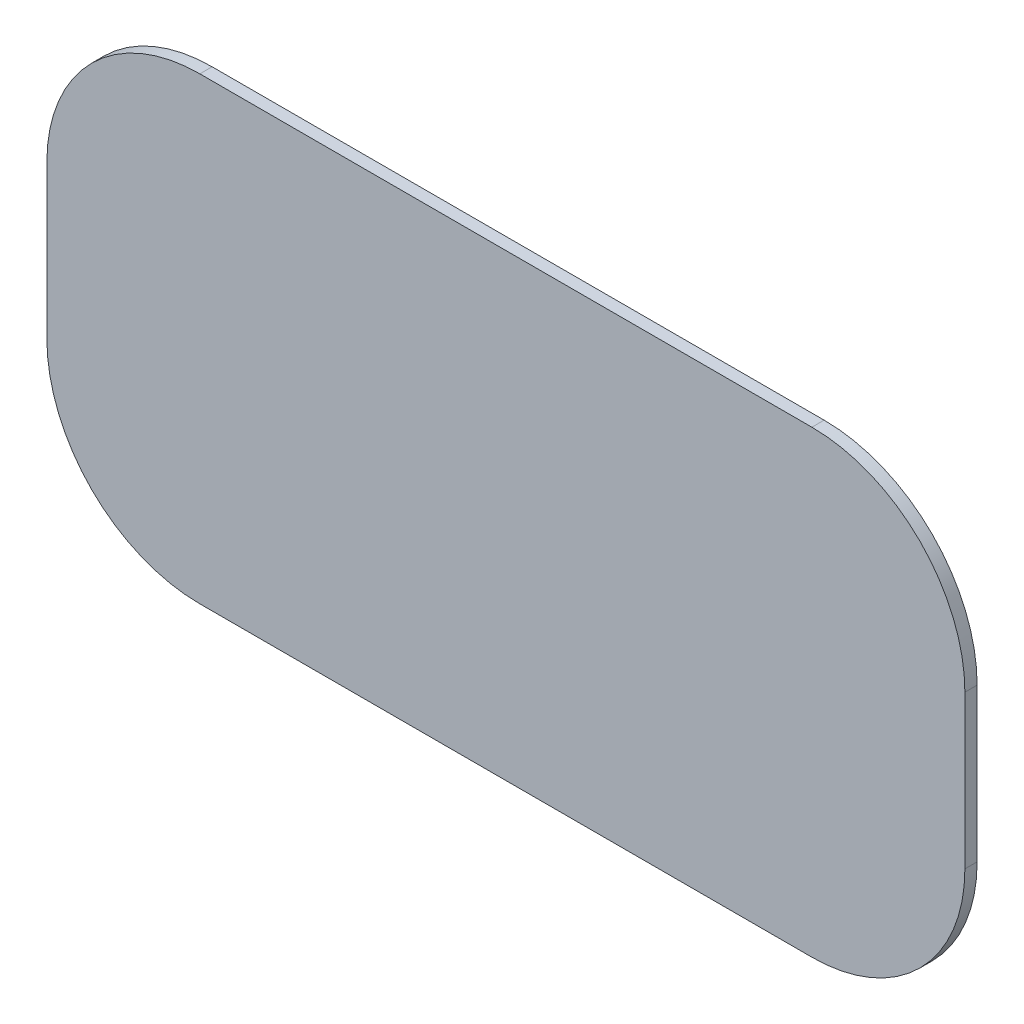
ISO-10303-21;
HEADER;
FILE_DESCRIPTION(('STEP AP214'),'2;1');
FILE_NAME('part.step','',(''),(''),'','','');
FILE_SCHEMA(('AUTOMOTIVE_DESIGN { 1 0 10303 214 1 1 1 1 }'));
ENDSEC;
DATA;
#1=APPLICATION_CONTEXT('core data for automotive mechanical design processes');
#2=APPLICATION_PROTOCOL_DEFINITION('international standard','automotive_design',2000,#1);
#3=PRODUCT_CONTEXT('',#1,'mechanical');
#4=PRODUCT('Part','Part','',(#3));
#5=PRODUCT_RELATED_PRODUCT_CATEGORY('part','',(#4));
#6=PRODUCT_DEFINITION_FORMATION('','',#4);
#7=PRODUCT_DEFINITION_CONTEXT('part definition',#1,'design');
#8=PRODUCT_DEFINITION('design','',#6,#7);
#9=PRODUCT_DEFINITION_SHAPE('','',#8);
#10=(LENGTH_UNIT() NAMED_UNIT(*) SI_UNIT(.MILLI.,.METRE.));
#11=(NAMED_UNIT(*) PLANE_ANGLE_UNIT() SI_UNIT($,.RADIAN.));
#12=(NAMED_UNIT(*) SI_UNIT($,.STERADIAN.) SOLID_ANGLE_UNIT());
#13=UNCERTAINTY_MEASURE_WITH_UNIT(LENGTH_MEASURE(1.E-05),#10,'distance_accuracy_value','');
#14=(GEOMETRIC_REPRESENTATION_CONTEXT(3) GLOBAL_UNCERTAINTY_ASSIGNED_CONTEXT((#13)) GLOBAL_UNIT_ASSIGNED_CONTEXT((#10,
#11,#12)) REPRESENTATION_CONTEXT('',''));
#15=CARTESIAN_POINT('',(0.,0.,0.));
#16=DIRECTION('',(0.,0.,1.));
#17=DIRECTION('',(1.,0.,0.));
#18=AXIS2_PLACEMENT_3D('',#15,#16,#17);
#19=CARTESIAN_POINT('',(10.,-10.,0.8));
#20=DIRECTION('',(0.,0.,-1.));
#21=DIRECTION('',(-1.,0.,0.));
#22=AXIS2_PLACEMENT_3D('',#19,#20,#21);
#23=CYLINDRICAL_SURFACE('',#22,10.);
#24=CARTESIAN_POINT('',(10.,-10.,0.));
#25=DIRECTION('',(0.,0.,1.));
#26=DIRECTION('',(1.,0.,0.));
#27=AXIS2_PLACEMENT_3D('',#24,#25,#26);
#28=CIRCLE('',#27,10.);
#29=CARTESIAN_POINT('',(10.0000000000001,0.,0.));
#30=VERTEX_POINT('',#29);
#31=CARTESIAN_POINT('',(0.,-10.,0.));
#32=VERTEX_POINT('',#31);
#33=EDGE_CURVE('E135',#30,#32,#28,.T.);
#34=ORIENTED_EDGE('',*,*,#33,.T.);
#35=DIRECTION('',(0.,0.,-1.));
#36=VECTOR('',#35,1.);
#37=CARTESIAN_POINT('',(0.,-10.,0.8));
#38=LINE('',#37,#36);
#39=CARTESIAN_POINT('',(0.,-10.,0.8));
#40=VERTEX_POINT('',#39);
#41=EDGE_CURVE('E11',#40,#32,#38,.T.);
#42=ORIENTED_EDGE('',*,*,#41,.F.);
#43=CARTESIAN_POINT('',(10.,-10.,0.8));
#44=DIRECTION('',(0.,0.,1.));
#45=DIRECTION('',(1.,0.,0.));
#46=AXIS2_PLACEMENT_3D('',#43,#44,#45);
#47=CIRCLE('',#46,10.);
#48=CARTESIAN_POINT('',(10.0000000000001,0.,0.8));
#49=VERTEX_POINT('',#48);
#50=EDGE_CURVE('E149',#49,#40,#47,.T.);
#51=ORIENTED_EDGE('',*,*,#50,.F.);
#52=DIRECTION('',(0.,0.,-1.));
#53=VECTOR('',#52,1.);
#54=CARTESIAN_POINT('',(10.0000000000001,0.,0.8));
#55=LINE('',#54,#53);
#56=EDGE_CURVE('E131',#49,#30,#55,.T.);
#57=ORIENTED_EDGE('',*,*,#56,.T.);
#58=EDGE_LOOP('',(#34,#42,#51,#57));
#59=FACE_BOUND('',#58,.T.);
#60=ADVANCED_FACE('F39',(#59),#23,.T.);
#61=CARTESIAN_POINT('',(0.,-10.,0.8));
#62=DIRECTION('',(1.,0.,0.));
#63=DIRECTION('',(0.,0.,-1.));
#64=AXIS2_PLACEMENT_3D('',#61,#62,#63);
#65=PLANE('',#64);
#66=DIRECTION('',(0.,-1.,0.));
#67=VECTOR('',#66,1.);
#68=CARTESIAN_POINT('',(0.,-10.,0.));
#69=LINE('',#68,#67);
#70=CARTESIAN_POINT('',(0.,-20.,0.));
#71=VERTEX_POINT('',#70);
#72=EDGE_CURVE('E138',#32,#71,#69,.T.);
#73=ORIENTED_EDGE('',*,*,#72,.T.);
#74=DIRECTION('',(0.,0.,-1.));
#75=VECTOR('',#74,1.);
#76=CARTESIAN_POINT('',(0.,-20.,0.8));
#77=LINE('',#76,#75);
#78=CARTESIAN_POINT('',(0.,-20.,0.8));
#79=VERTEX_POINT('',#78);
#80=EDGE_CURVE('E47',#79,#71,#77,.T.);
#81=ORIENTED_EDGE('',*,*,#80,.F.);
#82=DIRECTION('',(0.,-1.,0.));
#83=VECTOR('',#82,1.);
#84=CARTESIAN_POINT('',(0.,-10.,0.8));
#85=LINE('',#84,#83);
#86=EDGE_CURVE('E98',#40,#79,#85,.T.);
#87=ORIENTED_EDGE('',*,*,#86,.F.);
#88=ORIENTED_EDGE('',*,*,#41,.T.);
#89=EDGE_LOOP('',(#73,#81,#87,#88));
#90=FACE_BOUND('',#89,.T.);
#91=ADVANCED_FACE('F184',(#90),#65,.F.);
#92=CARTESIAN_POINT('',(10.,-20.,0.8));
#93=DIRECTION('',(0.,0.,-1.));
#94=DIRECTION('',(-1.,0.,0.));
#95=AXIS2_PLACEMENT_3D('',#92,#93,#94);
#96=CYLINDRICAL_SURFACE('',#95,10.);
#97=CARTESIAN_POINT('',(10.,-20.,0.));
#98=DIRECTION('',(0.,0.,1.));
#99=DIRECTION('',(1.,0.,0.));
#100=AXIS2_PLACEMENT_3D('',#97,#98,#99);
#101=CIRCLE('',#100,10.);
#102=CARTESIAN_POINT('',(10.,-30.,0.));
#103=VERTEX_POINT('',#102);
#104=EDGE_CURVE('E140',#71,#103,#101,.T.);
#105=ORIENTED_EDGE('',*,*,#104,.T.);
#106=DIRECTION('',(0.,0.,-1.));
#107=VECTOR('',#106,1.);
#108=CARTESIAN_POINT('',(10.,-30.,0.8));
#109=LINE('',#108,#107);
#110=CARTESIAN_POINT('',(10.,-30.,0.8));
#111=VERTEX_POINT('',#110);
#112=EDGE_CURVE('E156',#111,#103,#109,.T.);
#113=ORIENTED_EDGE('',*,*,#112,.F.);
#114=CARTESIAN_POINT('',(10.,-20.,0.8));
#115=DIRECTION('',(0.,0.,1.));
#116=DIRECTION('',(1.,0.,0.));
#117=AXIS2_PLACEMENT_3D('',#114,#115,#116);
#118=CIRCLE('',#117,10.);
#119=EDGE_CURVE('E164',#79,#111,#118,.T.);
#120=ORIENTED_EDGE('',*,*,#119,.F.);
#121=ORIENTED_EDGE('',*,*,#80,.T.);
#122=EDGE_LOOP('',(#105,#113,#120,#121));
#123=FACE_BOUND('',#122,.T.);
#124=ADVANCED_FACE('F162',(#123),#96,.T.);
#125=CARTESIAN_POINT('',(10.,-30.,0.8));
#126=DIRECTION('',(0.,1.,0.));
#127=DIRECTION('',(0.,0.,1.));
#128=AXIS2_PLACEMENT_3D('',#125,#126,#127);
#129=PLANE('',#128);
#130=DIRECTION('',(1.,0.,0.));
#131=VECTOR('',#130,1.);
#132=CARTESIAN_POINT('',(10.,-30.,0.));
#133=LINE('',#132,#131);
#134=CARTESIAN_POINT('',(50.,-30.,0.));
#135=VERTEX_POINT('',#134);
#136=EDGE_CURVE('E142',#103,#135,#133,.T.);
#137=ORIENTED_EDGE('',*,*,#136,.T.);
#138=DIRECTION('',(0.,0.,-1.));
#139=VECTOR('',#138,1.);
#140=CARTESIAN_POINT('',(50.,-30.,0.8));
#141=LINE('',#140,#139);
#142=CARTESIAN_POINT('',(50.,-30.,0.8));
#143=VERTEX_POINT('',#142);
#144=EDGE_CURVE('E153',#143,#135,#141,.T.);
#145=ORIENTED_EDGE('',*,*,#144,.F.);
#146=DIRECTION('',(1.,0.,0.));
#147=VECTOR('',#146,1.);
#148=CARTESIAN_POINT('',(10.,-30.,0.8));
#149=LINE('',#148,#147);
#150=EDGE_CURVE('E176',#111,#143,#149,.T.);
#151=ORIENTED_EDGE('',*,*,#150,.F.);
#152=ORIENTED_EDGE('',*,*,#112,.T.);
#153=EDGE_LOOP('',(#137,#145,#151,#152));
#154=FACE_BOUND('',#153,.T.);
#155=ADVANCED_FACE('F172',(#154),#129,.F.);
#156=CARTESIAN_POINT('',(50.,-20.,0.8));
#157=DIRECTION('',(0.,0.,-1.));
#158=DIRECTION('',(-1.,0.,0.));
#159=AXIS2_PLACEMENT_3D('',#156,#157,#158);
#160=CYLINDRICAL_SURFACE('',#159,9.99999999999999);
#161=CARTESIAN_POINT('',(50.,-20.,0.));
#162=DIRECTION('',(0.,0.,1.));
#163=DIRECTION('',(1.,0.,0.));
#164=AXIS2_PLACEMENT_3D('',#161,#162,#163);
#165=CIRCLE('',#164,9.99999999999999);
#166=CARTESIAN_POINT('',(60.,-20.,0.));
#167=VERTEX_POINT('',#166);
#168=EDGE_CURVE('E144',#135,#167,#165,.T.);
#169=ORIENTED_EDGE('',*,*,#168,.T.);
#170=DIRECTION('',(0.,0.,-1.));
#171=VECTOR('',#170,1.);
#172=CARTESIAN_POINT('',(60.,-20.,0.8));
#173=LINE('',#172,#171);
#174=CARTESIAN_POINT('',(60.,-20.,0.8));
#175=VERTEX_POINT('',#174);
#176=EDGE_CURVE('E126',#175,#167,#173,.T.);
#177=ORIENTED_EDGE('',*,*,#176,.F.);
#178=CARTESIAN_POINT('',(50.,-20.,0.8));
#179=DIRECTION('',(0.,0.,1.));
#180=DIRECTION('',(1.,0.,0.));
#181=AXIS2_PLACEMENT_3D('',#178,#179,#180);
#182=CIRCLE('',#181,9.99999999999999);
#183=EDGE_CURVE('E117',#143,#175,#182,.T.);
#184=ORIENTED_EDGE('',*,*,#183,.F.);
#185=ORIENTED_EDGE('',*,*,#144,.T.);
#186=EDGE_LOOP('',(#169,#177,#184,#185));
#187=FACE_BOUND('',#186,.T.);
#188=ADVANCED_FACE('F175',(#187),#160,.T.);
#189=CARTESIAN_POINT('',(60.,-10.,0.8));
#190=DIRECTION('',(-1.,0.,0.));
#191=DIRECTION('',(0.,-1.,0.));
#192=AXIS2_PLACEMENT_3D('',#189,#190,#191);
#193=PLANE('',#192);
#194=DIRECTION('',(0.,1.,0.));
#195=VECTOR('',#194,1.);
#196=CARTESIAN_POINT('',(60.,-10.,0.));
#197=LINE('',#196,#195);
#198=CARTESIAN_POINT('',(60.,-9.99999999999999,0.));
#199=VERTEX_POINT('',#198);
#200=EDGE_CURVE('E125',#167,#199,#197,.T.);
#201=ORIENTED_EDGE('',*,*,#200,.T.);
#202=DIRECTION('',(0.,0.,-1.));
#203=VECTOR('',#202,1.);
#204=CARTESIAN_POINT('',(60.,-9.99999999999999,0.8));
#205=LINE('',#204,#203);
#206=CARTESIAN_POINT('',(60.,-9.99999999999999,0.8));
#207=VERTEX_POINT('',#206);
#208=EDGE_CURVE('E122',#207,#199,#205,.T.);
#209=ORIENTED_EDGE('',*,*,#208,.F.);
#210=DIRECTION('',(0.,1.,0.));
#211=VECTOR('',#210,1.);
#212=CARTESIAN_POINT('',(60.,-10.,0.8));
#213=LINE('',#212,#211);
#214=EDGE_CURVE('E111',#175,#207,#213,.T.);
#215=ORIENTED_EDGE('',*,*,#214,.F.);
#216=ORIENTED_EDGE('',*,*,#176,.T.);
#217=EDGE_LOOP('',(#201,#209,#215,#216));
#218=FACE_BOUND('',#217,.T.);
#219=ADVANCED_FACE('F123',(#218),#193,.F.);
#220=CARTESIAN_POINT('',(50.,-10.,0.8));
#221=DIRECTION('',(0.,0.,-1.));
#222=DIRECTION('',(-1.,0.,0.));
#223=AXIS2_PLACEMENT_3D('',#220,#221,#222);
#224=CYLINDRICAL_SURFACE('',#223,10.);
#225=CARTESIAN_POINT('',(50.,-10.,0.));
#226=DIRECTION('',(0.,0.,1.));
#227=DIRECTION('',(-1.,0.,0.));
#228=AXIS2_PLACEMENT_3D('',#225,#226,#227);
#229=CIRCLE('',#228,10.);
#230=CARTESIAN_POINT('',(50.,0.,0.));
#231=VERTEX_POINT('',#230);
#232=EDGE_CURVE('E84',#199,#231,#229,.T.);
#233=ORIENTED_EDGE('',*,*,#232,.T.);
#234=DIRECTION('',(0.,0.,-1.));
#235=VECTOR('',#234,1.);
#236=CARTESIAN_POINT('',(50.,0.,0.8));
#237=LINE('',#236,#235);
#238=CARTESIAN_POINT('',(50.,0.,0.8));
#239=VERTEX_POINT('',#238);
#240=EDGE_CURVE('E127',#239,#231,#237,.T.);
#241=ORIENTED_EDGE('',*,*,#240,.F.);
#242=CARTESIAN_POINT('',(50.,-10.,0.8));
#243=DIRECTION('',(0.,0.,1.));
#244=DIRECTION('',(-1.,0.,0.));
#245=AXIS2_PLACEMENT_3D('',#242,#243,#244);
#246=CIRCLE('',#245,10.);
#247=EDGE_CURVE('E115',#207,#239,#246,.T.);
#248=ORIENTED_EDGE('',*,*,#247,.F.);
#249=ORIENTED_EDGE('',*,*,#208,.T.);
#250=EDGE_LOOP('',(#233,#241,#248,#249));
#251=FACE_BOUND('',#250,.T.);
#252=ADVANCED_FACE('F129',(#251),#224,.T.);
#253=CARTESIAN_POINT('',(10.0000000000001,0.,0.8));
#254=DIRECTION('',(0.,-1.,0.));
#255=DIRECTION('',(0.,0.,-1.));
#256=AXIS2_PLACEMENT_3D('',#253,#254,#255);
#257=PLANE('',#256);
#258=DIRECTION('',(-1.,0.,0.));
#259=VECTOR('',#258,1.);
#260=CARTESIAN_POINT('',(10.0000000000001,0.,0.));
#261=LINE('',#260,#259);
#262=EDGE_CURVE('E90',#231,#30,#261,.T.);
#263=ORIENTED_EDGE('',*,*,#262,.T.);
#264=ORIENTED_EDGE('',*,*,#56,.F.);
#265=DIRECTION('',(-1.,0.,0.));
#266=VECTOR('',#265,1.);
#267=CARTESIAN_POINT('',(10.0000000000001,0.,0.8));
#268=LINE('',#267,#266);
#269=EDGE_CURVE('E55',#239,#49,#268,.T.);
#270=ORIENTED_EDGE('',*,*,#269,.F.);
#271=ORIENTED_EDGE('',*,*,#240,.T.);
#272=EDGE_LOOP('',(#263,#264,#270,#271));
#273=FACE_BOUND('',#272,.T.);
#274=ADVANCED_FACE('F200',(#273),#257,.F.);
#275=CARTESIAN_POINT('',(10.,-10.,0.8));
#276=DIRECTION('',(0.,0.,1.));
#277=DIRECTION('',(1.,0.,0.));
#278=AXIS2_PLACEMENT_3D('',#275,#276,#277);
#279=PLANE('',#278);
#280=ORIENTED_EDGE('',*,*,#50,.T.);
#281=ORIENTED_EDGE('',*,*,#86,.T.);
#282=ORIENTED_EDGE('',*,*,#119,.T.);
#283=ORIENTED_EDGE('',*,*,#150,.T.);
#284=ORIENTED_EDGE('',*,*,#183,.T.);
#285=ORIENTED_EDGE('',*,*,#214,.T.);
#286=ORIENTED_EDGE('',*,*,#247,.T.);
#287=ORIENTED_EDGE('',*,*,#269,.T.);
#288=EDGE_LOOP('',(#280,#281,#282,#283,#284,#285,#286,#287));
#289=FACE_BOUND('',#288,.T.);
#290=ADVANCED_FACE('F113',(#289),#279,.T.);
#291=CARTESIAN_POINT('',(10.,-10.,0.));
#292=DIRECTION('',(0.,0.,1.));
#293=DIRECTION('',(1.,0.,0.));
#294=AXIS2_PLACEMENT_3D('',#291,#292,#293);
#295=PLANE('',#294);
#296=ORIENTED_EDGE('',*,*,#33,.F.);
#297=ORIENTED_EDGE('',*,*,#262,.F.);
#298=ORIENTED_EDGE('',*,*,#232,.F.);
#299=ORIENTED_EDGE('',*,*,#200,.F.);
#300=ORIENTED_EDGE('',*,*,#168,.F.);
#301=ORIENTED_EDGE('',*,*,#136,.F.);
#302=ORIENTED_EDGE('',*,*,#104,.F.);
#303=ORIENTED_EDGE('',*,*,#72,.F.);
#304=EDGE_LOOP('',(#296,#297,#298,#299,#300,#301,#302,#303));
#305=FACE_BOUND('',#304,.T.);
#306=ADVANCED_FACE('F168',(#305),#295,.F.);
#307=CLOSED_SHELL('',(#60,#91,#124,#155,#188,#219,#252,#274,#290,#306));
#308=MANIFOLD_SOLID_BREP('B2',#307);
#309=ADVANCED_BREP_SHAPE_REPRESENTATION('',(#18,#308),#14);
#310=SHAPE_DEFINITION_REPRESENTATION(#9,#309);
ENDSEC;
END-ISO-10303-21;
